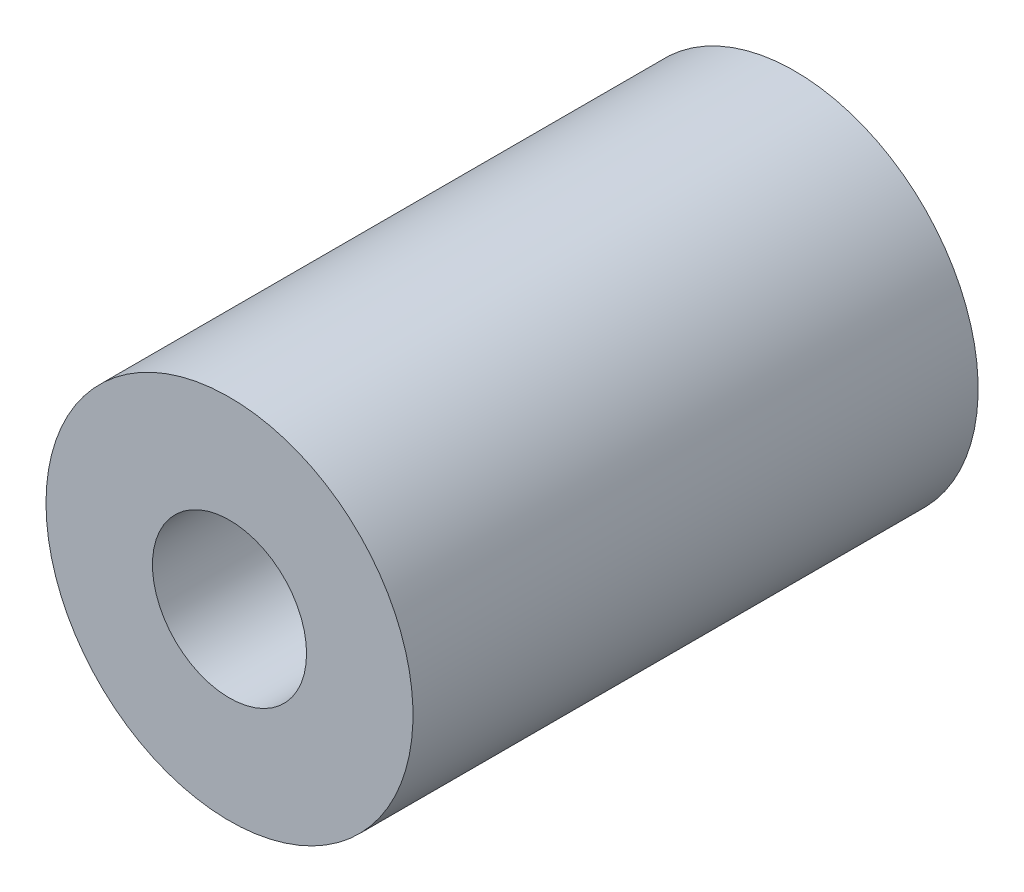
ISO-10303-21;
HEADER;
FILE_DESCRIPTION(('STEP AP214'),'2;1');
FILE_NAME('part.step','',(''),(''),'','','');
FILE_SCHEMA(('AUTOMOTIVE_DESIGN { 1 0 10303 214 1 1 1 1 }'));
ENDSEC;
DATA;
#1=APPLICATION_CONTEXT('core data for automotive mechanical design processes');
#2=APPLICATION_PROTOCOL_DEFINITION('international standard','automotive_design',2000,#1);
#3=PRODUCT_CONTEXT('',#1,'mechanical');
#4=PRODUCT('Part','Part','',(#3));
#5=PRODUCT_RELATED_PRODUCT_CATEGORY('part','',(#4));
#6=PRODUCT_DEFINITION_FORMATION('','',#4);
#7=PRODUCT_DEFINITION_CONTEXT('part definition',#1,'design');
#8=PRODUCT_DEFINITION('design','',#6,#7);
#9=PRODUCT_DEFINITION_SHAPE('','',#8);
#10=(LENGTH_UNIT() NAMED_UNIT(*) SI_UNIT(.MILLI.,.METRE.));
#11=(NAMED_UNIT(*) PLANE_ANGLE_UNIT() SI_UNIT($,.RADIAN.));
#12=(NAMED_UNIT(*) SI_UNIT($,.STERADIAN.) SOLID_ANGLE_UNIT());
#13=UNCERTAINTY_MEASURE_WITH_UNIT(LENGTH_MEASURE(1.E-05),#10,'distance_accuracy_value','');
#14=(GEOMETRIC_REPRESENTATION_CONTEXT(3) GLOBAL_UNCERTAINTY_ASSIGNED_CONTEXT((#13)) GLOBAL_UNIT_ASSIGNED_CONTEXT((#10,
#11,#12)) REPRESENTATION_CONTEXT('',''));
#15=CARTESIAN_POINT('',(0.,0.,0.));
#16=DIRECTION('',(0.,0.,1.));
#17=DIRECTION('',(1.,0.,0.));
#18=AXIS2_PLACEMENT_3D('',#15,#16,#17);
#19=CARTESIAN_POINT('',(0.,0.,15.4));
#20=DIRECTION('',(0.,0.,-1.));
#21=DIRECTION('',(-1.,0.,0.));
#22=AXIS2_PLACEMENT_3D('',#19,#20,#21);
#23=CYLINDRICAL_SURFACE('',#22,5.);
#24=CARTESIAN_POINT('',(0.,0.,15.4));
#25=DIRECTION('',(0.,0.,1.));
#26=DIRECTION('',(1.,0.,0.));
#27=AXIS2_PLACEMENT_3D('',#24,#25,#26);
#28=CIRCLE('',#27,5.);
#29=CARTESIAN_POINT('',(-5.,0.,15.4));
#30=VERTEX_POINT('',#29);
#31=EDGE_CURVE('E10',#30,#30,#28,.T.);
#32=CARTESIAN_POINT('',(0.,0.,0.));
#33=DIRECTION('',(0.,0.,1.));
#34=DIRECTION('',(1.,0.,0.));
#35=AXIS2_PLACEMENT_3D('',#32,#33,#34);
#36=CIRCLE('',#35,5.);
#37=CARTESIAN_POINT('',(-5.,0.,0.));
#38=VERTEX_POINT('',#37);
#39=EDGE_CURVE('E36',#38,#38,#36,.T.);
#40=CARTESIAN_POINT('',(-5.,0.,15.4));
#41=CARTESIAN_POINT('',(-5.,0.,15.2395833333333));
#42=CARTESIAN_POINT('',(-5.,0.,15.0791666666667));
#43=CARTESIAN_POINT('',(-5.,0.,14.7583333333333));
#44=CARTESIAN_POINT('',(-5.,0.,14.5979166666667));
#45=CARTESIAN_POINT('',(-5.,0.,14.2770833333333));
#46=CARTESIAN_POINT('',(-5.,0.,14.1166666666667));
#47=CARTESIAN_POINT('',(-5.,0.,13.7958333333333));
#48=CARTESIAN_POINT('',(-5.,0.,13.6354166666667));
#49=CARTESIAN_POINT('',(-5.,0.,13.3145833333333));
#50=CARTESIAN_POINT('',(-5.,0.,13.1541666666667));
#51=CARTESIAN_POINT('',(-5.,0.,12.8333333333333));
#52=CARTESIAN_POINT('',(-5.,0.,12.6729166666667));
#53=CARTESIAN_POINT('',(-5.,0.,12.3520833333333));
#54=CARTESIAN_POINT('',(-5.,0.,12.1916666666667));
#55=CARTESIAN_POINT('',(-5.,0.,11.8708333333333));
#56=CARTESIAN_POINT('',(-5.,0.,11.7104166666667));
#57=CARTESIAN_POINT('',(-5.,0.,11.3895833333333));
#58=CARTESIAN_POINT('',(-5.,0.,11.2291666666667));
#59=CARTESIAN_POINT('',(-5.,0.,10.9083333333333));
#60=CARTESIAN_POINT('',(-5.,0.,10.7479166666667));
#61=CARTESIAN_POINT('',(-5.,0.,10.4270833333333));
#62=CARTESIAN_POINT('',(-5.,0.,10.2666666666667));
#63=CARTESIAN_POINT('',(-5.,0.,9.94583333333333));
#64=CARTESIAN_POINT('',(-5.,0.,9.78541666666667));
#65=CARTESIAN_POINT('',(-5.,0.,9.46458333333333));
#66=CARTESIAN_POINT('',(-5.,0.,9.30416666666667));
#67=CARTESIAN_POINT('',(-5.,0.,8.98333333333333));
#68=CARTESIAN_POINT('',(-5.,0.,8.82291666666667));
#69=CARTESIAN_POINT('',(-5.,0.,8.50208333333333));
#70=CARTESIAN_POINT('',(-5.,0.,8.34166666666667));
#71=CARTESIAN_POINT('',(-5.,0.,8.02083333333333));
#72=CARTESIAN_POINT('',(-5.,0.,7.86041666666667));
#73=CARTESIAN_POINT('',(-5.,0.,7.53958333333333));
#74=CARTESIAN_POINT('',(-5.,0.,7.37916666666667));
#75=CARTESIAN_POINT('',(-5.,0.,7.05833333333333));
#76=CARTESIAN_POINT('',(-5.,0.,6.89791666666667));
#77=CARTESIAN_POINT('',(-5.,0.,6.57708333333333));
#78=CARTESIAN_POINT('',(-5.,0.,6.41666666666667));
#79=CARTESIAN_POINT('',(-5.,0.,6.09583333333333));
#80=CARTESIAN_POINT('',(-5.,0.,5.93541666666667));
#81=CARTESIAN_POINT('',(-5.,0.,5.61458333333333));
#82=CARTESIAN_POINT('',(-5.,0.,5.45416666666667));
#83=CARTESIAN_POINT('',(-5.,0.,5.13333333333333));
#84=CARTESIAN_POINT('',(-5.,0.,4.97291666666667));
#85=CARTESIAN_POINT('',(-5.,0.,4.65208333333333));
#86=CARTESIAN_POINT('',(-5.,0.,4.49166666666667));
#87=CARTESIAN_POINT('',(-5.,0.,4.17083333333333));
#88=CARTESIAN_POINT('',(-5.,0.,4.01041666666667));
#89=CARTESIAN_POINT('',(-5.,0.,3.68958333333333));
#90=CARTESIAN_POINT('',(-5.,0.,3.52916666666667));
#91=CARTESIAN_POINT('',(-5.,0.,3.20833333333333));
#92=CARTESIAN_POINT('',(-5.,0.,3.04791666666667));
#93=CARTESIAN_POINT('',(-5.,0.,2.72708333333333));
#94=CARTESIAN_POINT('',(-5.,0.,2.56666666666667));
#95=CARTESIAN_POINT('',(-5.,0.,2.24583333333333));
#96=CARTESIAN_POINT('',(-5.,0.,2.08541666666666));
#97=CARTESIAN_POINT('',(-5.,0.,1.76458333333333));
#98=CARTESIAN_POINT('',(-5.,0.,1.60416666666667));
#99=CARTESIAN_POINT('',(-5.,0.,1.28333333333333));
#100=CARTESIAN_POINT('',(-5.,0.,1.12291666666666));
#101=CARTESIAN_POINT('',(-5.,0.,0.802083333333332));
#102=CARTESIAN_POINT('',(-5.,0.,0.641666666666665));
#103=CARTESIAN_POINT('',(-5.,0.,0.320833333333332));
#104=CARTESIAN_POINT('',(-5.,0.,0.160416666666665));
#105=CARTESIAN_POINT('',(-5.,0.,0.));
#106=B_SPLINE_CURVE_WITH_KNOTS('',3,(#40,#41,#42,#43,#44,#45,#46,#47,#48,#49,#50,#51,#52,#53,
#54,#55,#56,#57,#58,#59,#60,#61,#62,#63,#64,#65,#66,#67,#68,#69,#70,#71,#72,#73,#74,#75,#76,#77,
#78,#79,#80,#81,#82,#83,#84,#85,#86,#87,#88,#89,#90,#91,#92,#93,#94,#95,#96,#97,#98,#99,#100,
#101,#102,#103,#104,#105),.UNSPECIFIED.,.F.,.F.,(4,2,2,2,2,2,2,2,2,2,2,2,2,2,2,2,2,2,2,2,2,2,2,
2,2,2,2,2,2,2,2,2,4),(0.,0.481249999999999,0.9625,1.44375,1.925,2.40625,2.8875,3.36875,3.85,
4.33125,4.8125,5.29375,5.775,6.25625,6.7375,7.21875,7.7,8.18125,8.6625,9.14375,9.625,10.10625,
10.5875,11.06875,11.55,12.03125,12.5125,12.99375,13.475,13.95625,14.4375,14.91875,15.4),.UNSPECIFIED.);
#107=EDGE_CURVE('BSEAM33',#30,#38,#106,.T.);
#108=ORIENTED_EDGE('',*,*,#31,.F.);
#109=ORIENTED_EDGE('',*,*,#39,.T.);
#110=ORIENTED_EDGE('',*,*,#107,.T.);
#111=ORIENTED_EDGE('',*,*,#107,.F.);
#112=EDGE_LOOP('',(#108,#110,#109,#111));
#113=FACE_BOUND('',#112,.T.);
#114=ADVANCED_FACE('F33',(#113),#23,.T.);
#115=CARTESIAN_POINT('',(0.,0.,15.4));
#116=DIRECTION('',(0.,0.,1.));
#117=DIRECTION('',(1.,0.,0.));
#118=AXIS2_PLACEMENT_3D('',#115,#116,#117);
#119=PLANE('',#118);
#120=CARTESIAN_POINT('',(0.,0.,15.4));
#121=DIRECTION('',(0.,0.,1.));
#122=DIRECTION('',(1.,0.,0.));
#123=AXIS2_PLACEMENT_3D('',#120,#121,#122);
#124=CIRCLE('',#123,2.1);
#125=CARTESIAN_POINT('',(2.1,0.,15.4));
#126=VERTEX_POINT('',#125);
#127=EDGE_CURVE('E43',#126,#126,#124,.T.);
#128=ORIENTED_EDGE('',*,*,#127,.F.);
#129=EDGE_LOOP('',(#128));
#130=FACE_BOUND('',#129,.T.);
#131=ORIENTED_EDGE('',*,*,#31,.T.);
#132=EDGE_LOOP('',(#131));
#133=FACE_BOUND('',#132,.T.);
#134=ADVANCED_FACE('F60',(#130,#133),#119,.T.);
#135=CARTESIAN_POINT('',(0.,0.,0.));
#136=DIRECTION('',(0.,0.,1.));
#137=DIRECTION('',(1.,0.,0.));
#138=AXIS2_PLACEMENT_3D('',#135,#136,#137);
#139=PLANE('',#138);
#140=CARTESIAN_POINT('',(0.,0.,0.));
#141=DIRECTION('',(0.,0.,1.));
#142=DIRECTION('',(1.,0.,0.));
#143=AXIS2_PLACEMENT_3D('',#140,#141,#142);
#144=CIRCLE('',#143,2.1);
#145=CARTESIAN_POINT('',(2.1,0.,0.));
#146=VERTEX_POINT('',#145);
#147=EDGE_CURVE('E47',#146,#146,#144,.T.);
#148=ORIENTED_EDGE('',*,*,#147,.T.);
#149=EDGE_LOOP('',(#148));
#150=FACE_BOUND('',#149,.T.);
#151=ORIENTED_EDGE('',*,*,#39,.F.);
#152=EDGE_LOOP('',(#151));
#153=FACE_BOUND('',#152,.T.);
#154=ADVANCED_FACE('F51',(#150,#153),#139,.F.);
#155=CARTESIAN_POINT('',(0.,0.,5.4));
#156=DIRECTION('',(0.,0.,1.));
#157=DIRECTION('',(1.,0.,0.));
#158=AXIS2_PLACEMENT_3D('',#155,#156,#157);
#159=CYLINDRICAL_SURFACE('',#158,2.1);
#160=ORIENTED_EDGE('',*,*,#147,.F.);
#161=EDGE_LOOP('',(#160));
#162=FACE_BOUND('',#161,.T.);
#163=ORIENTED_EDGE('',*,*,#127,.T.);
#164=EDGE_LOOP('',(#163));
#165=FACE_BOUND('',#164,.T.);
#166=ADVANCED_FACE('F54',(#162,#165),#159,.F.);
#167=CLOSED_SHELL('',(#114,#134,#154,#166));
#168=MANIFOLD_SOLID_BREP('B2',#167);
#169=ADVANCED_BREP_SHAPE_REPRESENTATION('',(#18,#168),#14);
#170=SHAPE_DEFINITION_REPRESENTATION(#9,#169);
ENDSEC;
END-ISO-10303-21;
